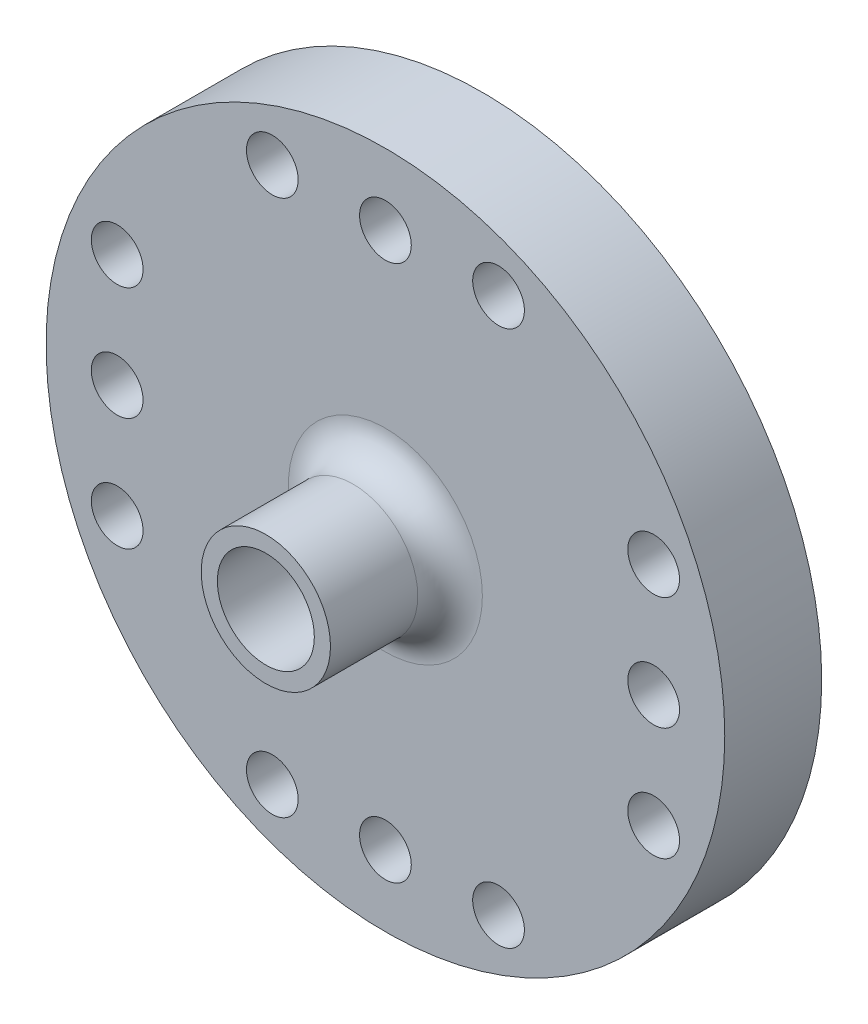
ISO-10303-21;
HEADER;
FILE_DESCRIPTION(('STEP AP214'),'2;1');
FILE_NAME('part.step','',(''),(''),'','','');
FILE_SCHEMA(('AUTOMOTIVE_DESIGN { 1 0 10303 214 1 1 1 1 }'));
ENDSEC;
DATA;
#1=APPLICATION_CONTEXT('core data for automotive mechanical design processes');
#2=APPLICATION_PROTOCOL_DEFINITION('international standard','automotive_design',2000,#1);
#3=PRODUCT_CONTEXT('',#1,'mechanical');
#4=PRODUCT('Part','Part','',(#3));
#5=PRODUCT_RELATED_PRODUCT_CATEGORY('part','',(#4));
#6=PRODUCT_DEFINITION_FORMATION('','',#4);
#7=PRODUCT_DEFINITION_CONTEXT('part definition',#1,'design');
#8=PRODUCT_DEFINITION('design','',#6,#7);
#9=PRODUCT_DEFINITION_SHAPE('','',#8);
#10=(LENGTH_UNIT() NAMED_UNIT(*) SI_UNIT(.MILLI.,.METRE.));
#11=(NAMED_UNIT(*) PLANE_ANGLE_UNIT() SI_UNIT($,.RADIAN.));
#12=(NAMED_UNIT(*) SI_UNIT($,.STERADIAN.) SOLID_ANGLE_UNIT());
#13=UNCERTAINTY_MEASURE_WITH_UNIT(LENGTH_MEASURE(1.E-05),#10,'distance_accuracy_value','');
#14=(GEOMETRIC_REPRESENTATION_CONTEXT(3) GLOBAL_UNCERTAINTY_ASSIGNED_CONTEXT((#13)) GLOBAL_UNIT_ASSIGNED_CONTEXT((#10,
#11,#12)) REPRESENTATION_CONTEXT('',''));
#15=CARTESIAN_POINT('',(0.,0.,0.));
#16=DIRECTION('',(0.,0.,1.));
#17=DIRECTION('',(1.,0.,0.));
#18=AXIS2_PLACEMENT_3D('',#15,#16,#17);
#19=CARTESIAN_POINT('',(-15.5701861616692,4.53474990652862,4.));
#20=DIRECTION('',(0.,0.,1.));
#21=DIRECTION('',(1.,0.,0.));
#22=AXIS2_PLACEMENT_3D('',#19,#20,#21);
#23=TOROIDAL_SURFACE('',#22,3.,1.);
#24=CARTESIAN_POINT('',(-15.5701861616692,4.53474990652862,4.));
#25=DIRECTION('',(0.,0.,1.));
#26=DIRECTION('',(1.,0.,0.));
#27=AXIS2_PLACEMENT_3D('',#24,#25,#26);
#28=CIRCLE('',#27,2.);
#29=CARTESIAN_POINT('',(-13.5701861616692,4.53474990652862,4.));
#30=VERTEX_POINT('',#29);
#31=EDGE_CURVE('E38',#30,#30,#28,.T.);
#32=ORIENTED_EDGE('',*,*,#31,.F.);
#33=EDGE_LOOP('',(#32));
#34=FACE_BOUND('',#33,.T.);
#35=CARTESIAN_POINT('',(-15.5701861616692,4.53474990652862,3.));
#36=DIRECTION('',(0.,0.,1.));
#37=DIRECTION('',(1.,0.,0.));
#38=AXIS2_PLACEMENT_3D('',#35,#36,#37);
#39=CIRCLE('',#38,3.);
#40=CARTESIAN_POINT('',(-12.5701861616692,4.53474990652862,3.));
#41=VERTEX_POINT('',#40);
#42=EDGE_CURVE('E10',#41,#41,#39,.F.);
#43=ORIENTED_EDGE('',*,*,#42,.F.);
#44=EDGE_LOOP('',(#43));
#45=FACE_BOUND('',#44,.T.);
#46=ADVANCED_FACE('F32',(#34,#45),#23,.F.);
#47=CARTESIAN_POINT('',(0.,0.,3.));
#48=DIRECTION('',(0.,0.,1.));
#49=DIRECTION('',(1.,0.,0.));
#50=AXIS2_PLACEMENT_3D('',#47,#48,#49);
#51=PLANE('',#50);
#52=ORIENTED_EDGE('',*,*,#42,.T.);
#53=EDGE_LOOP('',(#52));
#54=FACE_BOUND('',#53,.T.);
#55=CARTESIAN_POINT('',(-15.5701861616692,4.53474990652862,3.));
#56=DIRECTION('',(0.,0.,1.));
#57=DIRECTION('',(1.,0.,0.));
#58=AXIS2_PLACEMENT_3D('',#55,#56,#57);
#59=CIRCLE('',#58,10.5);
#60=CARTESIAN_POINT('',(-5.07018616166916,4.53474990652862,3.));
#61=VERTEX_POINT('',#60);
#62=EDGE_CURVE('E42',#61,#61,#59,.T.);
#63=ORIENTED_EDGE('',*,*,#62,.T.);
#64=EDGE_LOOP('',(#63));
#65=FACE_BOUND('',#64,.T.);
#66=CARTESIAN_POINT('',(-12.0701861616692,12.8347499065286,3.));
#67=DIRECTION('',(0.,0.,1.));
#68=DIRECTION('',(1.,0.,0.));
#69=AXIS2_PLACEMENT_3D('',#66,#67,#68);
#70=CIRCLE('',#69,0.800000000000001);
#71=CARTESIAN_POINT('',(-11.2701861616692,12.8347499065286,3.));
#72=VERTEX_POINT('',#71);
#73=EDGE_CURVE('E46',#72,#72,#70,.T.);
#74=ORIENTED_EDGE('',*,*,#73,.F.);
#75=EDGE_LOOP('',(#74));
#76=FACE_BOUND('',#75,.T.);
#77=CARTESIAN_POINT('',(-7.27018616166916,4.53474990652862,3.));
#78=DIRECTION('',(0.,0.,1.));
#79=DIRECTION('',(1.,0.,0.));
#80=AXIS2_PLACEMENT_3D('',#77,#78,#79);
#81=CIRCLE('',#80,0.800000000000001);
#82=CARTESIAN_POINT('',(-6.47018616166916,4.53474990652862,3.));
#83=VERTEX_POINT('',#82);
#84=EDGE_CURVE('E95',#83,#83,#81,.T.);
#85=ORIENTED_EDGE('',*,*,#84,.F.);
#86=EDGE_LOOP('',(#85));
#87=FACE_BOUND('',#86,.T.);
#88=CARTESIAN_POINT('',(-15.5701861616692,12.8347499065286,3.));
#89=DIRECTION('',(0.,0.,1.));
#90=DIRECTION('',(1.,0.,0.));
#91=AXIS2_PLACEMENT_3D('',#88,#89,#90);
#92=CIRCLE('',#91,0.800000000000001);
#93=CARTESIAN_POINT('',(-14.7701861616692,12.8347499065286,3.));
#94=VERTEX_POINT('',#93);
#95=EDGE_CURVE('E98',#94,#94,#92,.T.);
#96=ORIENTED_EDGE('',*,*,#95,.F.);
#97=EDGE_LOOP('',(#96));
#98=FACE_BOUND('',#97,.T.);
#99=CARTESIAN_POINT('',(-15.5701861616692,-3.76525009347138,3.));
#100=DIRECTION('',(0.,0.,1.));
#101=DIRECTION('',(1.,0.,0.));
#102=AXIS2_PLACEMENT_3D('',#99,#100,#101);
#103=CIRCLE('',#102,0.800000000000001);
#104=CARTESIAN_POINT('',(-14.7701861616692,-3.76525009347138,3.));
#105=VERTEX_POINT('',#104);
#106=EDGE_CURVE('E101',#105,#105,#103,.T.);
#107=ORIENTED_EDGE('',*,*,#106,.F.);
#108=EDGE_LOOP('',(#107));
#109=FACE_BOUND('',#108,.T.);
#110=CARTESIAN_POINT('',(-19.0701861616692,12.8347499065286,3.));
#111=DIRECTION('',(0.,0.,1.));
#112=DIRECTION('',(1.,0.,0.));
#113=AXIS2_PLACEMENT_3D('',#110,#111,#112);
#114=CIRCLE('',#113,0.799999999999999);
#115=CARTESIAN_POINT('',(-18.2701861616692,12.8347499065286,3.));
#116=VERTEX_POINT('',#115);
#117=EDGE_CURVE('E104',#116,#116,#114,.T.);
#118=ORIENTED_EDGE('',*,*,#117,.F.);
#119=EDGE_LOOP('',(#118));
#120=FACE_BOUND('',#119,.T.);
#121=CARTESIAN_POINT('',(-19.0701861616692,-3.76525009347138,3.));
#122=DIRECTION('',(0.,0.,1.));
#123=DIRECTION('',(1.,0.,0.));
#124=AXIS2_PLACEMENT_3D('',#121,#122,#123);
#125=CIRCLE('',#124,0.799999999999999);
#126=CARTESIAN_POINT('',(-18.2701861616692,-3.76525009347138,3.));
#127=VERTEX_POINT('',#126);
#128=EDGE_CURVE('E107',#127,#127,#125,.T.);
#129=ORIENTED_EDGE('',*,*,#128,.F.);
#130=EDGE_LOOP('',(#129));
#131=FACE_BOUND('',#130,.T.);
#132=CARTESIAN_POINT('',(-12.0701861616692,-3.76525009347138,3.));
#133=DIRECTION('',(0.,0.,1.));
#134=DIRECTION('',(1.,0.,0.));
#135=AXIS2_PLACEMENT_3D('',#132,#133,#134);
#136=CIRCLE('',#135,0.800000000000001);
#137=CARTESIAN_POINT('',(-11.2701861616692,-3.76525009347138,3.));
#138=VERTEX_POINT('',#137);
#139=EDGE_CURVE('E110',#138,#138,#136,.T.);
#140=ORIENTED_EDGE('',*,*,#139,.F.);
#141=EDGE_LOOP('',(#140));
#142=FACE_BOUND('',#141,.T.);
#143=CARTESIAN_POINT('',(-7.27018616166916,8.03474990652862,3.));
#144=DIRECTION('',(0.,0.,1.));
#145=DIRECTION('',(1.,0.,0.));
#146=AXIS2_PLACEMENT_3D('',#143,#144,#145);
#147=CIRCLE('',#146,0.800000000000001);
#148=CARTESIAN_POINT('',(-6.47018616166916,8.03474990652862,3.));
#149=VERTEX_POINT('',#148);
#150=EDGE_CURVE('E113',#149,#149,#147,.T.);
#151=ORIENTED_EDGE('',*,*,#150,.F.);
#152=EDGE_LOOP('',(#151));
#153=FACE_BOUND('',#152,.T.);
#154=CARTESIAN_POINT('',(-7.27018616166916,1.03474990652862,3.));
#155=DIRECTION('',(0.,0.,1.));
#156=DIRECTION('',(1.,0.,0.));
#157=AXIS2_PLACEMENT_3D('',#154,#155,#156);
#158=CIRCLE('',#157,0.800000000000001);
#159=CARTESIAN_POINT('',(-6.47018616166916,1.03474990652862,3.));
#160=VERTEX_POINT('',#159);
#161=EDGE_CURVE('E116',#160,#160,#158,.T.);
#162=ORIENTED_EDGE('',*,*,#161,.F.);
#163=EDGE_LOOP('',(#162));
#164=FACE_BOUND('',#163,.T.);
#165=CARTESIAN_POINT('',(-23.8701861616692,1.03474990652862,3.));
#166=DIRECTION('',(0.,0.,1.));
#167=DIRECTION('',(1.,0.,0.));
#168=AXIS2_PLACEMENT_3D('',#165,#166,#167);
#169=CIRCLE('',#168,0.799999999999999);
#170=CARTESIAN_POINT('',(-23.0701861616692,1.03474990652862,3.));
#171=VERTEX_POINT('',#170);
#172=EDGE_CURVE('E119',#171,#171,#169,.T.);
#173=ORIENTED_EDGE('',*,*,#172,.F.);
#174=EDGE_LOOP('',(#173));
#175=FACE_BOUND('',#174,.T.);
#176=CARTESIAN_POINT('',(-23.8701861616692,4.53474990652862,3.));
#177=DIRECTION('',(0.,0.,1.));
#178=DIRECTION('',(1.,0.,0.));
#179=AXIS2_PLACEMENT_3D('',#176,#177,#178);
#180=CIRCLE('',#179,0.799999999999999);
#181=CARTESIAN_POINT('',(-23.0701861616692,4.53474990652862,3.));
#182=VERTEX_POINT('',#181);
#183=EDGE_CURVE('E122',#182,#182,#180,.T.);
#184=ORIENTED_EDGE('',*,*,#183,.F.);
#185=EDGE_LOOP('',(#184));
#186=FACE_BOUND('',#185,.T.);
#187=CARTESIAN_POINT('',(-23.8701861616692,8.03474990652862,3.));
#188=DIRECTION('',(0.,0.,1.));
#189=DIRECTION('',(1.,0.,0.));
#190=AXIS2_PLACEMENT_3D('',#187,#188,#189);
#191=CIRCLE('',#190,0.799999999999999);
#192=CARTESIAN_POINT('',(-23.0701861616692,8.03474990652862,3.));
#193=VERTEX_POINT('',#192);
#194=EDGE_CURVE('E52',#193,#193,#191,.T.);
#195=ORIENTED_EDGE('',*,*,#194,.F.);
#196=EDGE_LOOP('',(#195));
#197=FACE_BOUND('',#196,.T.);
#198=ADVANCED_FACE('F150',(#54,#65,#76,#87,#98,#109,#120,#131,#142,#153,#164,#175,#186,#197),
#51,.T.);
#199=CARTESIAN_POINT('',(-12.0701861616692,12.8347499065286,3.));
#200=DIRECTION('',(0.,0.,-1.));
#201=DIRECTION('',(-1.,0.,0.));
#202=AXIS2_PLACEMENT_3D('',#199,#200,#201);
#203=CYLINDRICAL_SURFACE('',#202,0.800000000000001);
#204=ORIENTED_EDGE('',*,*,#73,.T.);
#205=EDGE_LOOP('',(#204));
#206=FACE_BOUND('',#205,.T.);
#207=CARTESIAN_POINT('',(-12.0701861616692,12.8347499065286,0.));
#208=DIRECTION('',(0.,0.,1.));
#209=DIRECTION('',(1.,0.,0.));
#210=AXIS2_PLACEMENT_3D('',#207,#208,#209);
#211=CIRCLE('',#210,0.800000000000001);
#212=CARTESIAN_POINT('',(-11.2701861616692,12.8347499065286,0.));
#213=VERTEX_POINT('',#212);
#214=EDGE_CURVE('E53',#213,#213,#211,.T.);
#215=ORIENTED_EDGE('',*,*,#214,.F.);
#216=EDGE_LOOP('',(#215));
#217=FACE_BOUND('',#216,.T.);
#218=ADVANCED_FACE('F155',(#206,#217),#203,.F.);
#219=CARTESIAN_POINT('',(-15.5701861616692,4.53474990652862,3.));
#220=DIRECTION('',(0.,0.,-1.));
#221=DIRECTION('',(-1.,0.,0.));
#222=AXIS2_PLACEMENT_3D('',#219,#220,#221);
#223=CYLINDRICAL_SURFACE('',#222,1.5);
#224=CARTESIAN_POINT('',(-15.5701861616692,4.53474990652862,0.));
#225=DIRECTION('',(0.,0.,1.));
#226=DIRECTION('',(1.,0.,0.));
#227=AXIS2_PLACEMENT_3D('',#224,#225,#226);
#228=CIRCLE('',#227,1.5);
#229=CARTESIAN_POINT('',(-14.0701861616692,4.53474990652862,0.));
#230=VERTEX_POINT('',#229);
#231=EDGE_CURVE('E56',#230,#230,#228,.T.);
#232=ORIENTED_EDGE('',*,*,#231,.F.);
#233=EDGE_LOOP('',(#232));
#234=FACE_BOUND('',#233,.T.);
#235=CARTESIAN_POINT('',(-15.5701861616692,4.53474990652862,6.7));
#236=DIRECTION('',(0.,0.,1.));
#237=DIRECTION('',(1.,0.,0.));
#238=AXIS2_PLACEMENT_3D('',#235,#236,#237);
#239=CIRCLE('',#238,1.5);
#240=CARTESIAN_POINT('',(-14.0701861616692,4.53474990652862,6.7));
#241=VERTEX_POINT('',#240);
#242=EDGE_CURVE('E129',#241,#241,#239,.T.);
#243=ORIENTED_EDGE('',*,*,#242,.T.);
#244=EDGE_LOOP('',(#243));
#245=FACE_BOUND('',#244,.T.);
#246=ADVANCED_FACE('F133',(#234,#245),#223,.F.);
#247=CARTESIAN_POINT('',(-7.27018616166916,4.53474990652862,3.));
#248=DIRECTION('',(0.,0.,-1.));
#249=DIRECTION('',(-1.,0.,0.));
#250=AXIS2_PLACEMENT_3D('',#247,#248,#249);
#251=CYLINDRICAL_SURFACE('',#250,0.800000000000001);
#252=ORIENTED_EDGE('',*,*,#84,.T.);
#253=EDGE_LOOP('',(#252));
#254=FACE_BOUND('',#253,.T.);
#255=CARTESIAN_POINT('',(-7.27018616166916,4.53474990652862,0.));
#256=DIRECTION('',(0.,0.,1.));
#257=DIRECTION('',(1.,0.,0.));
#258=AXIS2_PLACEMENT_3D('',#255,#256,#257);
#259=CIRCLE('',#258,0.800000000000001);
#260=CARTESIAN_POINT('',(-6.47018616166916,4.53474990652862,0.));
#261=VERTEX_POINT('',#260);
#262=EDGE_CURVE('E59',#261,#261,#259,.T.);
#263=ORIENTED_EDGE('',*,*,#262,.F.);
#264=EDGE_LOOP('',(#263));
#265=FACE_BOUND('',#264,.T.);
#266=ADVANCED_FACE('F171',(#254,#265),#251,.F.);
#267=CARTESIAN_POINT('',(-15.5701861616692,12.8347499065286,3.));
#268=DIRECTION('',(0.,0.,-1.));
#269=DIRECTION('',(-1.,0.,0.));
#270=AXIS2_PLACEMENT_3D('',#267,#268,#269);
#271=CYLINDRICAL_SURFACE('',#270,0.800000000000001);
#272=ORIENTED_EDGE('',*,*,#95,.T.);
#273=EDGE_LOOP('',(#272));
#274=FACE_BOUND('',#273,.T.);
#275=CARTESIAN_POINT('',(-15.5701861616692,12.8347499065286,0.));
#276=DIRECTION('',(0.,0.,1.));
#277=DIRECTION('',(1.,0.,0.));
#278=AXIS2_PLACEMENT_3D('',#275,#276,#277);
#279=CIRCLE('',#278,0.800000000000001);
#280=CARTESIAN_POINT('',(-14.7701861616692,12.8347499065286,0.));
#281=VERTEX_POINT('',#280);
#282=EDGE_CURVE('E62',#281,#281,#279,.T.);
#283=ORIENTED_EDGE('',*,*,#282,.F.);
#284=EDGE_LOOP('',(#283));
#285=FACE_BOUND('',#284,.T.);
#286=ADVANCED_FACE('F175',(#274,#285),#271,.F.);
#287=CARTESIAN_POINT('',(-15.5701861616692,-3.76525009347138,3.));
#288=DIRECTION('',(0.,0.,-1.));
#289=DIRECTION('',(-1.,0.,0.));
#290=AXIS2_PLACEMENT_3D('',#287,#288,#289);
#291=CYLINDRICAL_SURFACE('',#290,0.800000000000001);
#292=ORIENTED_EDGE('',*,*,#106,.T.);
#293=EDGE_LOOP('',(#292));
#294=FACE_BOUND('',#293,.T.);
#295=CARTESIAN_POINT('',(-15.5701861616692,-3.76525009347138,0.));
#296=DIRECTION('',(0.,0.,1.));
#297=DIRECTION('',(1.,0.,0.));
#298=AXIS2_PLACEMENT_3D('',#295,#296,#297);
#299=CIRCLE('',#298,0.800000000000001);
#300=CARTESIAN_POINT('',(-14.7701861616692,-3.76525009347138,0.));
#301=VERTEX_POINT('',#300);
#302=EDGE_CURVE('E65',#301,#301,#299,.T.);
#303=ORIENTED_EDGE('',*,*,#302,.F.);
#304=EDGE_LOOP('',(#303));
#305=FACE_BOUND('',#304,.T.);
#306=ADVANCED_FACE('F179',(#294,#305),#291,.F.);
#307=CARTESIAN_POINT('',(-19.0701861616692,12.8347499065286,3.));
#308=DIRECTION('',(0.,0.,-1.));
#309=DIRECTION('',(-1.,0.,0.));
#310=AXIS2_PLACEMENT_3D('',#307,#308,#309);
#311=CYLINDRICAL_SURFACE('',#310,0.799999999999999);
#312=ORIENTED_EDGE('',*,*,#117,.T.);
#313=EDGE_LOOP('',(#312));
#314=FACE_BOUND('',#313,.T.);
#315=CARTESIAN_POINT('',(-19.0701861616692,12.8347499065286,0.));
#316=DIRECTION('',(0.,0.,1.));
#317=DIRECTION('',(1.,0.,0.));
#318=AXIS2_PLACEMENT_3D('',#315,#316,#317);
#319=CIRCLE('',#318,0.799999999999999);
#320=CARTESIAN_POINT('',(-18.2701861616692,12.8347499065286,0.));
#321=VERTEX_POINT('',#320);
#322=EDGE_CURVE('E68',#321,#321,#319,.T.);
#323=ORIENTED_EDGE('',*,*,#322,.F.);
#324=EDGE_LOOP('',(#323));
#325=FACE_BOUND('',#324,.T.);
#326=ADVANCED_FACE('F183',(#314,#325),#311,.F.);
#327=CARTESIAN_POINT('',(-19.0701861616692,-3.76525009347138,3.));
#328=DIRECTION('',(0.,0.,-1.));
#329=DIRECTION('',(-1.,0.,0.));
#330=AXIS2_PLACEMENT_3D('',#327,#328,#329);
#331=CYLINDRICAL_SURFACE('',#330,0.799999999999999);
#332=ORIENTED_EDGE('',*,*,#128,.T.);
#333=EDGE_LOOP('',(#332));
#334=FACE_BOUND('',#333,.T.);
#335=CARTESIAN_POINT('',(-19.0701861616692,-3.76525009347138,0.));
#336=DIRECTION('',(0.,0.,1.));
#337=DIRECTION('',(1.,0.,0.));
#338=AXIS2_PLACEMENT_3D('',#335,#336,#337);
#339=CIRCLE('',#338,0.799999999999999);
#340=CARTESIAN_POINT('',(-18.2701861616692,-3.76525009347138,0.));
#341=VERTEX_POINT('',#340);
#342=EDGE_CURVE('E71',#341,#341,#339,.T.);
#343=ORIENTED_EDGE('',*,*,#342,.F.);
#344=EDGE_LOOP('',(#343));
#345=FACE_BOUND('',#344,.T.);
#346=ADVANCED_FACE('F187',(#334,#345),#331,.F.);
#347=CARTESIAN_POINT('',(-12.0701861616692,-3.76525009347138,3.));
#348=DIRECTION('',(0.,0.,-1.));
#349=DIRECTION('',(-1.,0.,0.));
#350=AXIS2_PLACEMENT_3D('',#347,#348,#349);
#351=CYLINDRICAL_SURFACE('',#350,0.800000000000001);
#352=ORIENTED_EDGE('',*,*,#139,.T.);
#353=EDGE_LOOP('',(#352));
#354=FACE_BOUND('',#353,.T.);
#355=CARTESIAN_POINT('',(-12.0701861616692,-3.76525009347138,0.));
#356=DIRECTION('',(0.,0.,1.));
#357=DIRECTION('',(1.,0.,0.));
#358=AXIS2_PLACEMENT_3D('',#355,#356,#357);
#359=CIRCLE('',#358,0.800000000000001);
#360=CARTESIAN_POINT('',(-11.2701861616692,-3.76525009347138,0.));
#361=VERTEX_POINT('',#360);
#362=EDGE_CURVE('E74',#361,#361,#359,.T.);
#363=ORIENTED_EDGE('',*,*,#362,.F.);
#364=EDGE_LOOP('',(#363));
#365=FACE_BOUND('',#364,.T.);
#366=ADVANCED_FACE('F191',(#354,#365),#351,.F.);
#367=CARTESIAN_POINT('',(-7.27018616166916,8.03474990652862,3.));
#368=DIRECTION('',(0.,0.,-1.));
#369=DIRECTION('',(-1.,0.,0.));
#370=AXIS2_PLACEMENT_3D('',#367,#368,#369);
#371=CYLINDRICAL_SURFACE('',#370,0.800000000000001);
#372=ORIENTED_EDGE('',*,*,#150,.T.);
#373=EDGE_LOOP('',(#372));
#374=FACE_BOUND('',#373,.T.);
#375=CARTESIAN_POINT('',(-7.27018616166916,8.03474990652862,0.));
#376=DIRECTION('',(0.,0.,1.));
#377=DIRECTION('',(1.,0.,0.));
#378=AXIS2_PLACEMENT_3D('',#375,#376,#377);
#379=CIRCLE('',#378,0.800000000000001);
#380=CARTESIAN_POINT('',(-6.47018616166916,8.03474990652862,0.));
#381=VERTEX_POINT('',#380);
#382=EDGE_CURVE('E77',#381,#381,#379,.T.);
#383=ORIENTED_EDGE('',*,*,#382,.F.);
#384=EDGE_LOOP('',(#383));
#385=FACE_BOUND('',#384,.T.);
#386=ADVANCED_FACE('F195',(#374,#385),#371,.F.);
#387=CARTESIAN_POINT('',(-7.27018616166916,1.03474990652862,3.));
#388=DIRECTION('',(0.,0.,-1.));
#389=DIRECTION('',(-1.,0.,0.));
#390=AXIS2_PLACEMENT_3D('',#387,#388,#389);
#391=CYLINDRICAL_SURFACE('',#390,0.800000000000001);
#392=ORIENTED_EDGE('',*,*,#161,.T.);
#393=EDGE_LOOP('',(#392));
#394=FACE_BOUND('',#393,.T.);
#395=CARTESIAN_POINT('',(-7.27018616166916,1.03474990652862,0.));
#396=DIRECTION('',(0.,0.,1.));
#397=DIRECTION('',(1.,0.,0.));
#398=AXIS2_PLACEMENT_3D('',#395,#396,#397);
#399=CIRCLE('',#398,0.800000000000001);
#400=CARTESIAN_POINT('',(-6.47018616166916,1.03474990652862,0.));
#401=VERTEX_POINT('',#400);
#402=EDGE_CURVE('E80',#401,#401,#399,.T.);
#403=ORIENTED_EDGE('',*,*,#402,.F.);
#404=EDGE_LOOP('',(#403));
#405=FACE_BOUND('',#404,.T.);
#406=ADVANCED_FACE('F199',(#394,#405),#391,.F.);
#407=CARTESIAN_POINT('',(-23.8701861616692,1.03474990652862,3.));
#408=DIRECTION('',(0.,0.,-1.));
#409=DIRECTION('',(-1.,0.,0.));
#410=AXIS2_PLACEMENT_3D('',#407,#408,#409);
#411=CYLINDRICAL_SURFACE('',#410,0.799999999999999);
#412=ORIENTED_EDGE('',*,*,#172,.T.);
#413=EDGE_LOOP('',(#412));
#414=FACE_BOUND('',#413,.T.);
#415=CARTESIAN_POINT('',(-23.8701861616692,1.03474990652862,0.));
#416=DIRECTION('',(0.,0.,1.));
#417=DIRECTION('',(1.,0.,0.));
#418=AXIS2_PLACEMENT_3D('',#415,#416,#417);
#419=CIRCLE('',#418,0.799999999999999);
#420=CARTESIAN_POINT('',(-23.0701861616692,1.03474990652862,0.));
#421=VERTEX_POINT('',#420);
#422=EDGE_CURVE('E83',#421,#421,#419,.T.);
#423=ORIENTED_EDGE('',*,*,#422,.F.);
#424=EDGE_LOOP('',(#423));
#425=FACE_BOUND('',#424,.T.);
#426=ADVANCED_FACE('F203',(#414,#425),#411,.F.);
#427=CARTESIAN_POINT('',(-23.8701861616692,4.53474990652862,3.));
#428=DIRECTION('',(0.,0.,-1.));
#429=DIRECTION('',(-1.,0.,0.));
#430=AXIS2_PLACEMENT_3D('',#427,#428,#429);
#431=CYLINDRICAL_SURFACE('',#430,0.799999999999999);
#432=ORIENTED_EDGE('',*,*,#183,.T.);
#433=EDGE_LOOP('',(#432));
#434=FACE_BOUND('',#433,.T.);
#435=CARTESIAN_POINT('',(-23.8701861616692,4.53474990652862,0.));
#436=DIRECTION('',(0.,0.,1.));
#437=DIRECTION('',(1.,0.,0.));
#438=AXIS2_PLACEMENT_3D('',#435,#436,#437);
#439=CIRCLE('',#438,0.799999999999999);
#440=CARTESIAN_POINT('',(-23.0701861616692,4.53474990652862,0.));
#441=VERTEX_POINT('',#440);
#442=EDGE_CURVE('E86',#441,#441,#439,.T.);
#443=ORIENTED_EDGE('',*,*,#442,.F.);
#444=EDGE_LOOP('',(#443));
#445=FACE_BOUND('',#444,.T.);
#446=ADVANCED_FACE('F207',(#434,#445),#431,.F.);
#447=CARTESIAN_POINT('',(-23.8701861616692,8.03474990652862,3.));
#448=DIRECTION('',(0.,0.,-1.));
#449=DIRECTION('',(-1.,0.,0.));
#450=AXIS2_PLACEMENT_3D('',#447,#448,#449);
#451=CYLINDRICAL_SURFACE('',#450,0.799999999999999);
#452=ORIENTED_EDGE('',*,*,#194,.T.);
#453=EDGE_LOOP('',(#452));
#454=FACE_BOUND('',#453,.T.);
#455=CARTESIAN_POINT('',(-23.8701861616692,8.03474990652862,0.));
#456=DIRECTION('',(0.,0.,1.));
#457=DIRECTION('',(1.,0.,0.));
#458=AXIS2_PLACEMENT_3D('',#455,#456,#457);
#459=CIRCLE('',#458,0.799999999999999);
#460=CARTESIAN_POINT('',(-23.0701861616692,8.03474990652862,0.));
#461=VERTEX_POINT('',#460);
#462=EDGE_CURVE('E89',#461,#461,#459,.T.);
#463=ORIENTED_EDGE('',*,*,#462,.F.);
#464=EDGE_LOOP('',(#463));
#465=FACE_BOUND('',#464,.T.);
#466=ADVANCED_FACE('F166',(#454,#465),#451,.F.);
#467=CARTESIAN_POINT('',(-15.5701861616692,4.53474990652862,3.));
#468=DIRECTION('',(0.,0.,-1.));
#469=DIRECTION('',(-1.,0.,0.));
#470=AXIS2_PLACEMENT_3D('',#467,#468,#469);
#471=CYLINDRICAL_SURFACE('',#470,10.5);
#472=ORIENTED_EDGE('',*,*,#62,.F.);
#473=EDGE_LOOP('',(#472));
#474=FACE_BOUND('',#473,.T.);
#475=CARTESIAN_POINT('',(-15.5701861616692,4.53474990652862,0.));
#476=DIRECTION('',(0.,0.,1.));
#477=DIRECTION('',(1.,0.,0.));
#478=AXIS2_PLACEMENT_3D('',#475,#476,#477);
#479=CIRCLE('',#478,10.5);
#480=CARTESIAN_POINT('',(-5.07018616166916,4.53474990652862,0.));
#481=VERTEX_POINT('',#480);
#482=EDGE_CURVE('E49',#481,#481,#479,.T.);
#483=ORIENTED_EDGE('',*,*,#482,.T.);
#484=EDGE_LOOP('',(#483));
#485=FACE_BOUND('',#484,.T.);
#486=ADVANCED_FACE('F146',(#474,#485),#471,.T.);
#487=CARTESIAN_POINT('',(0.,0.,0.));
#488=DIRECTION('',(0.,0.,1.));
#489=DIRECTION('',(1.,0.,0.));
#490=AXIS2_PLACEMENT_3D('',#487,#488,#489);
#491=PLANE('',#490);
#492=ORIENTED_EDGE('',*,*,#462,.T.);
#493=EDGE_LOOP('',(#492));
#494=FACE_BOUND('',#493,.T.);
#495=ORIENTED_EDGE('',*,*,#442,.T.);
#496=EDGE_LOOP('',(#495));
#497=FACE_BOUND('',#496,.T.);
#498=ORIENTED_EDGE('',*,*,#422,.T.);
#499=EDGE_LOOP('',(#498));
#500=FACE_BOUND('',#499,.T.);
#501=ORIENTED_EDGE('',*,*,#402,.T.);
#502=EDGE_LOOP('',(#501));
#503=FACE_BOUND('',#502,.T.);
#504=ORIENTED_EDGE('',*,*,#382,.T.);
#505=EDGE_LOOP('',(#504));
#506=FACE_BOUND('',#505,.T.);
#507=ORIENTED_EDGE('',*,*,#362,.T.);
#508=EDGE_LOOP('',(#507));
#509=FACE_BOUND('',#508,.T.);
#510=ORIENTED_EDGE('',*,*,#342,.T.);
#511=EDGE_LOOP('',(#510));
#512=FACE_BOUND('',#511,.T.);
#513=ORIENTED_EDGE('',*,*,#322,.T.);
#514=EDGE_LOOP('',(#513));
#515=FACE_BOUND('',#514,.T.);
#516=ORIENTED_EDGE('',*,*,#302,.T.);
#517=EDGE_LOOP('',(#516));
#518=FACE_BOUND('',#517,.T.);
#519=ORIENTED_EDGE('',*,*,#282,.T.);
#520=EDGE_LOOP('',(#519));
#521=FACE_BOUND('',#520,.T.);
#522=ORIENTED_EDGE('',*,*,#262,.T.);
#523=EDGE_LOOP('',(#522));
#524=FACE_BOUND('',#523,.T.);
#525=ORIENTED_EDGE('',*,*,#231,.T.);
#526=EDGE_LOOP('',(#525));
#527=FACE_BOUND('',#526,.T.);
#528=ORIENTED_EDGE('',*,*,#214,.T.);
#529=EDGE_LOOP('',(#528));
#530=FACE_BOUND('',#529,.T.);
#531=ORIENTED_EDGE('',*,*,#482,.F.);
#532=EDGE_LOOP('',(#531));
#533=FACE_BOUND('',#532,.T.);
#534=ADVANCED_FACE('F138',(#494,#497,#500,#503,#506,#509,#512,#515,#518,#521,#524,#527,#530,
#533),#491,.F.);
#535=CARTESIAN_POINT('',(-15.5701861616692,4.53474990652862,6.7));
#536=DIRECTION('',(0.,0.,1.));
#537=DIRECTION('',(1.,0.,0.));
#538=AXIS2_PLACEMENT_3D('',#535,#536,#537);
#539=PLANE('',#538);
#540=CARTESIAN_POINT('',(-15.5701861616692,4.53474990652862,6.7));
#541=DIRECTION('',(0.,0.,1.));
#542=DIRECTION('',(1.,0.,0.));
#543=AXIS2_PLACEMENT_3D('',#540,#541,#542);
#544=CIRCLE('',#543,2.);
#545=CARTESIAN_POINT('',(-13.5701861616692,4.53474990652862,6.7));
#546=VERTEX_POINT('',#545);
#547=EDGE_CURVE('E91',#546,#546,#544,.T.);
#548=ORIENTED_EDGE('',*,*,#547,.T.);
#549=EDGE_LOOP('',(#548));
#550=FACE_BOUND('',#549,.T.);
#551=ORIENTED_EDGE('',*,*,#242,.F.);
#552=EDGE_LOOP('',(#551));
#553=FACE_BOUND('',#552,.T.);
#554=ADVANCED_FACE('F135',(#550,#553),#539,.T.);
#555=CARTESIAN_POINT('',(-15.5701861616692,4.53474990652862,6.7));
#556=DIRECTION('',(0.,0.,-1.));
#557=DIRECTION('',(-1.,0.,0.));
#558=AXIS2_PLACEMENT_3D('',#555,#556,#557);
#559=CYLINDRICAL_SURFACE('',#558,2.);
#560=ORIENTED_EDGE('',*,*,#31,.T.);
#561=EDGE_LOOP('',(#560));
#562=FACE_BOUND('',#561,.T.);
#563=ORIENTED_EDGE('',*,*,#547,.F.);
#564=EDGE_LOOP('',(#563));
#565=FACE_BOUND('',#564,.T.);
#566=ADVANCED_FACE('F137',(#562,#565),#559,.T.);
#567=CLOSED_SHELL('',(#46,#198,#218,#246,#266,#286,#306,#326,#346,#366,#386,#406,#426,#446,#466,
#486,#534,#554,#566));
#568=MANIFOLD_SOLID_BREP('B2',#567);
#569=ADVANCED_BREP_SHAPE_REPRESENTATION('',(#18,#568),#14);
#570=SHAPE_DEFINITION_REPRESENTATION(#9,#569);
ENDSEC;
END-ISO-10303-21;
